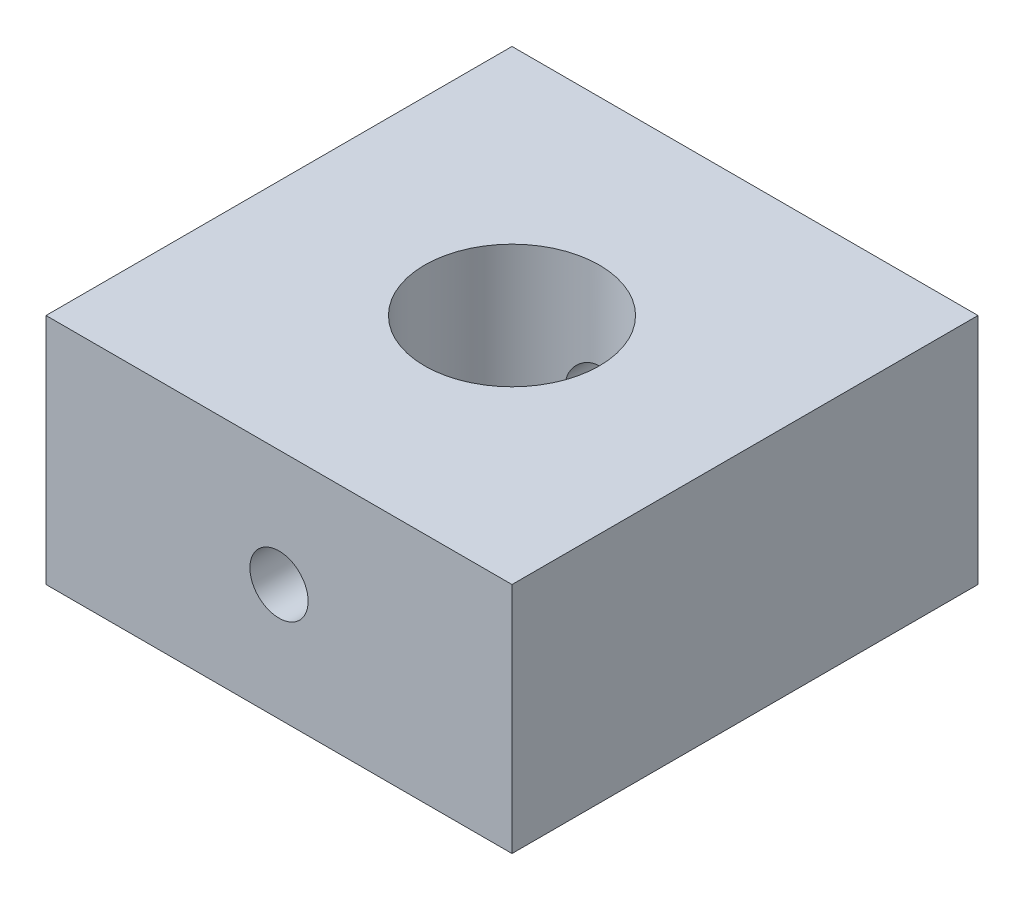
ISO-10303-21;
HEADER;
FILE_DESCRIPTION(('STEP AP214'),'2;1');
FILE_NAME('part.step','',(''),(''),'','','');
FILE_SCHEMA(('AUTOMOTIVE_DESIGN { 1 0 10303 214 1 1 1 1 }'));
ENDSEC;
DATA;
#1=APPLICATION_CONTEXT('core data for automotive mechanical design processes');
#2=APPLICATION_PROTOCOL_DEFINITION('international standard','automotive_design',2000,#1);
#3=PRODUCT_CONTEXT('',#1,'mechanical');
#4=PRODUCT('Part','Part','',(#3));
#5=PRODUCT_RELATED_PRODUCT_CATEGORY('part','',(#4));
#6=PRODUCT_DEFINITION_FORMATION('','',#4);
#7=PRODUCT_DEFINITION_CONTEXT('part definition',#1,'design');
#8=PRODUCT_DEFINITION('design','',#6,#7);
#9=PRODUCT_DEFINITION_SHAPE('','',#8);
#10=(LENGTH_UNIT() NAMED_UNIT(*) SI_UNIT(.MILLI.,.METRE.));
#11=(NAMED_UNIT(*) PLANE_ANGLE_UNIT() SI_UNIT($,.RADIAN.));
#12=(NAMED_UNIT(*) SI_UNIT($,.STERADIAN.) SOLID_ANGLE_UNIT());
#13=UNCERTAINTY_MEASURE_WITH_UNIT(LENGTH_MEASURE(1.E-05),#10,'distance_accuracy_value','');
#14=(GEOMETRIC_REPRESENTATION_CONTEXT(3) GLOBAL_UNCERTAINTY_ASSIGNED_CONTEXT((#13)) GLOBAL_UNIT_ASSIGNED_CONTEXT((#10,
#11,#12)) REPRESENTATION_CONTEXT('',''));
#15=CARTESIAN_POINT('',(0.,0.,0.));
#16=DIRECTION('',(0.,0.,1.));
#17=DIRECTION('',(1.,0.,0.));
#18=AXIS2_PLACEMENT_3D('',#15,#16,#17);
#19=CARTESIAN_POINT('',(0.,12.7,0.));
#20=DIRECTION('',(0.,-1.,0.));
#21=DIRECTION('',(0.,0.,-1.));
#22=AXIS2_PLACEMENT_3D('',#19,#20,#21);
#23=PLANE('',#22);
#24=DIRECTION('',(0.,0.,1.));
#25=VECTOR('',#24,1.);
#26=CARTESIAN_POINT('',(0.,12.7,0.));
#27=LINE('',#26,#25);
#28=CARTESIAN_POINT('',(0.,12.7,-25.4));
#29=VERTEX_POINT('',#28);
#30=CARTESIAN_POINT('',(0.,12.7,0.));
#31=VERTEX_POINT('',#30);
#32=EDGE_CURVE('E104',#29,#31,#27,.T.);
#33=ORIENTED_EDGE('',*,*,#32,.T.);
#34=DIRECTION('',(1.,0.,0.));
#35=VECTOR('',#34,1.);
#36=CARTESIAN_POINT('',(0.,12.7,0.));
#37=LINE('',#36,#35);
#38=CARTESIAN_POINT('',(25.4,12.7,0.));
#39=VERTEX_POINT('',#38);
#40=EDGE_CURVE('E99',#31,#39,#37,.T.);
#41=ORIENTED_EDGE('',*,*,#40,.T.);
#42=DIRECTION('',(0.,0.,-1.));
#43=VECTOR('',#42,1.);
#44=CARTESIAN_POINT('',(25.4,12.7,0.));
#45=LINE('',#44,#43);
#46=CARTESIAN_POINT('',(25.4,12.7,-25.4));
#47=VERTEX_POINT('',#46);
#48=EDGE_CURVE('E102',#39,#47,#45,.T.);
#49=ORIENTED_EDGE('',*,*,#48,.T.);
#50=DIRECTION('',(-1.,0.,0.));
#51=VECTOR('',#50,1.);
#52=CARTESIAN_POINT('',(0.,12.7,-25.4));
#53=LINE('',#52,#51);
#54=EDGE_CURVE('E69',#47,#29,#53,.T.);
#55=ORIENTED_EDGE('',*,*,#54,.T.);
#56=EDGE_LOOP('',(#33,#41,#49,#55));
#57=FACE_BOUND('',#56,.T.);
#58=CARTESIAN_POINT('',(12.7,12.7,-12.7));
#59=DIRECTION('',(0.,1.,0.));
#60=DIRECTION('',(0.,0.,1.));
#61=AXIS2_PLACEMENT_3D('',#58,#59,#60);
#62=CIRCLE('',#61,4.7625);
#63=CARTESIAN_POINT('',(12.7,12.7,-7.9375));
#64=VERTEX_POINT('',#63);
#65=EDGE_CURVE('E120',#64,#64,#62,.T.);
#66=ORIENTED_EDGE('',*,*,#65,.F.);
#67=EDGE_LOOP('',(#66));
#68=FACE_BOUND('',#67,.T.);
#69=ADVANCED_FACE('F46',(#57,#68),#23,.F.);
#70=CARTESIAN_POINT('',(0.,0.,0.));
#71=DIRECTION('',(0.,-1.,0.));
#72=DIRECTION('',(0.,0.,-1.));
#73=AXIS2_PLACEMENT_3D('',#70,#71,#72);
#74=PLANE('',#73);
#75=DIRECTION('',(0.,0.,1.));
#76=VECTOR('',#75,1.);
#77=CARTESIAN_POINT('',(0.,0.,0.));
#78=LINE('',#77,#76);
#79=CARTESIAN_POINT('',(0.,0.,-25.4));
#80=VERTEX_POINT('',#79);
#81=CARTESIAN_POINT('',(0.,0.,0.));
#82=VERTEX_POINT('',#81);
#83=EDGE_CURVE('E117',#80,#82,#78,.T.);
#84=ORIENTED_EDGE('',*,*,#83,.F.);
#85=DIRECTION('',(-1.,0.,0.));
#86=VECTOR('',#85,1.);
#87=CARTESIAN_POINT('',(0.,0.,-25.4));
#88=LINE('',#87,#86);
#89=CARTESIAN_POINT('',(25.4,0.,-25.4));
#90=VERTEX_POINT('',#89);
#91=EDGE_CURVE('E92',#90,#80,#88,.T.);
#92=ORIENTED_EDGE('',*,*,#91,.F.);
#93=DIRECTION('',(0.,0.,-1.));
#94=VECTOR('',#93,1.);
#95=CARTESIAN_POINT('',(25.4,0.,0.));
#96=LINE('',#95,#94);
#97=CARTESIAN_POINT('',(25.4,0.,0.));
#98=VERTEX_POINT('',#97);
#99=EDGE_CURVE('E86',#98,#90,#96,.T.);
#100=ORIENTED_EDGE('',*,*,#99,.F.);
#101=DIRECTION('',(1.,0.,0.));
#102=VECTOR('',#101,1.);
#103=CARTESIAN_POINT('',(0.,0.,0.));
#104=LINE('',#103,#102);
#105=EDGE_CURVE('E108',#82,#98,#104,.T.);
#106=ORIENTED_EDGE('',*,*,#105,.F.);
#107=EDGE_LOOP('',(#84,#92,#100,#106));
#108=FACE_BOUND('',#107,.T.);
#109=CARTESIAN_POINT('',(12.7,0.,-12.7));
#110=DIRECTION('',(0.,1.,0.));
#111=DIRECTION('',(0.,0.,1.));
#112=AXIS2_PLACEMENT_3D('',#109,#110,#111);
#113=CIRCLE('',#112,4.7625);
#114=CARTESIAN_POINT('',(12.7,0.,-7.9375));
#115=VERTEX_POINT('',#114);
#116=EDGE_CURVE('E174',#115,#115,#113,.T.);
#117=ORIENTED_EDGE('',*,*,#116,.T.);
#118=EDGE_LOOP('',(#117));
#119=FACE_BOUND('',#118,.T.);
#120=ADVANCED_FACE('F148',(#108,#119),#74,.T.);
#121=CARTESIAN_POINT('',(0.,12.7,0.));
#122=DIRECTION('',(1.,0.,0.));
#123=DIRECTION('',(0.,0.,-1.));
#124=AXIS2_PLACEMENT_3D('',#121,#122,#123);
#125=PLANE('',#124);
#126=ORIENTED_EDGE('',*,*,#83,.T.);
#127=DIRECTION('',(0.,-1.,0.));
#128=VECTOR('',#127,1.);
#129=CARTESIAN_POINT('',(0.,12.7,0.));
#130=LINE('',#129,#128);
#131=EDGE_CURVE('E13',#31,#82,#130,.T.);
#132=ORIENTED_EDGE('',*,*,#131,.F.);
#133=ORIENTED_EDGE('',*,*,#32,.F.);
#134=DIRECTION('',(0.,-1.,0.));
#135=VECTOR('',#134,1.);
#136=CARTESIAN_POINT('',(0.,12.7,-25.4));
#137=LINE('',#136,#135);
#138=EDGE_CURVE('E113',#29,#80,#137,.T.);
#139=ORIENTED_EDGE('',*,*,#138,.T.);
#140=EDGE_LOOP('',(#126,#132,#133,#139));
#141=FACE_BOUND('',#140,.T.);
#142=ADVANCED_FACE('F48',(#141),#125,.F.);
#143=CARTESIAN_POINT('',(0.,12.7,0.));
#144=DIRECTION('',(0.,0.,-1.));
#145=DIRECTION('',(-1.,0.,0.));
#146=AXIS2_PLACEMENT_3D('',#143,#144,#145);
#147=PLANE('',#146);
#148=CARTESIAN_POINT('',(12.7,6.35,0.));
#149=DIRECTION('',(0.,0.,1.));
#150=DIRECTION('',(1.,0.,0.));
#151=AXIS2_PLACEMENT_3D('',#148,#149,#150);
#152=CIRCLE('',#151,1.5875);
#153=CARTESIAN_POINT('',(14.2875,6.35,0.));
#154=VERTEX_POINT('',#153);
#155=EDGE_CURVE('E167',#154,#154,#152,.T.);
#156=ORIENTED_EDGE('',*,*,#155,.F.);
#157=EDGE_LOOP('',(#156));
#158=FACE_BOUND('',#157,.T.);
#159=ORIENTED_EDGE('',*,*,#105,.T.);
#160=DIRECTION('',(0.,-1.,0.));
#161=VECTOR('',#160,1.);
#162=CARTESIAN_POINT('',(25.4,12.7,0.));
#163=LINE('',#162,#161);
#164=EDGE_CURVE('E60',#39,#98,#163,.T.);
#165=ORIENTED_EDGE('',*,*,#164,.F.);
#166=ORIENTED_EDGE('',*,*,#40,.F.);
#167=ORIENTED_EDGE('',*,*,#131,.T.);
#168=EDGE_LOOP('',(#159,#165,#166,#167));
#169=FACE_BOUND('',#168,.T.);
#170=ADVANCED_FACE('F107',(#158,#169),#147,.F.);
#171=CARTESIAN_POINT('',(25.4,12.7,0.));
#172=DIRECTION('',(-1.,0.,0.));
#173=DIRECTION('',(0.,0.,1.));
#174=AXIS2_PLACEMENT_3D('',#171,#172,#173);
#175=PLANE('',#174);
#176=ORIENTED_EDGE('',*,*,#99,.T.);
#177=DIRECTION('',(0.,-1.,0.));
#178=VECTOR('',#177,1.);
#179=CARTESIAN_POINT('',(25.4,12.7,-25.4));
#180=LINE('',#179,#178);
#181=EDGE_CURVE('E109',#47,#90,#180,.T.);
#182=ORIENTED_EDGE('',*,*,#181,.F.);
#183=ORIENTED_EDGE('',*,*,#48,.F.);
#184=ORIENTED_EDGE('',*,*,#164,.T.);
#185=EDGE_LOOP('',(#176,#182,#183,#184));
#186=FACE_BOUND('',#185,.T.);
#187=ADVANCED_FACE('F111',(#186),#175,.F.);
#188=CARTESIAN_POINT('',(0.,12.7,-25.4));
#189=DIRECTION('',(0.,0.,1.));
#190=DIRECTION('',(1.,0.,0.));
#191=AXIS2_PLACEMENT_3D('',#188,#189,#190);
#192=PLANE('',#191);
#193=CARTESIAN_POINT('',(12.7,6.35,-25.4));
#194=DIRECTION('',(0.,0.,1.));
#195=DIRECTION('',(1.,0.,0.));
#196=AXIS2_PLACEMENT_3D('',#193,#194,#195);
#197=CIRCLE('',#196,1.5875);
#198=CARTESIAN_POINT('',(14.2875,6.35,-25.4));
#199=VERTEX_POINT('',#198);
#200=EDGE_CURVE('E129',#199,#199,#197,.T.);
#201=ORIENTED_EDGE('',*,*,#200,.T.);
#202=EDGE_LOOP('',(#201));
#203=FACE_BOUND('',#202,.T.);
#204=ORIENTED_EDGE('',*,*,#91,.T.);
#205=ORIENTED_EDGE('',*,*,#138,.F.);
#206=ORIENTED_EDGE('',*,*,#54,.F.);
#207=ORIENTED_EDGE('',*,*,#181,.T.);
#208=EDGE_LOOP('',(#204,#205,#206,#207));
#209=FACE_BOUND('',#208,.T.);
#210=ADVANCED_FACE('F144',(#203,#209),#192,.F.);
#211=CARTESIAN_POINT('',(12.7,12.7,-12.7));
#212=DIRECTION('',(0.,-1.,0.));
#213=DIRECTION('',(0.,0.,-1.));
#214=AXIS2_PLACEMENT_3D('',#211,#212,#213);
#215=CYLINDRICAL_SURFACE('',#214,4.7625);
#216=CARTESIAN_POINT('',(12.7,7.9375,-17.4625));
#217=CARTESIAN_POINT('',(12.6133806614173,7.93750040279898,-17.4625002429025));
#218=CARTESIAN_POINT('',(12.5267637536701,7.93038757752304,-17.4601150909323));
#219=CARTESIAN_POINT('',(12.3560812046142,7.90221128975267,-17.4508352119771));
#220=CARTESIAN_POINT('',(12.2720158291114,7.88114637898109,-17.4439400168342));
#221=CARTESIAN_POINT('',(12.1089216966659,7.82586820112782,-17.4263892630148));
#222=CARTESIAN_POINT('',(12.0298847764059,7.79167691334591,-17.4157399927273));
#223=CARTESIAN_POINT('',(11.8786672878215,7.71121588811913,-17.3917680757628));
#224=CARTESIAN_POINT('',(11.8064880758281,7.66494376805837,-17.378444901851));
#225=CARTESIAN_POINT('',(11.6685350909022,7.55995153478673,-17.3500112492827));
#226=CARTESIAN_POINT('',(11.6030316257764,7.50088791561147,-17.3348579588626));
#227=CARTESIAN_POINT('',(11.4826531003354,7.37271964190333,-17.3047074971821));
#228=CARTESIAN_POINT('',(11.4277803805355,7.30361278205099,-17.2897103609875));
#229=CARTESIAN_POINT('',(11.3286779042133,7.15488612962562,-17.2610991530767));
#230=CARTESIAN_POINT('',(11.2847995375741,7.07502118817526,-17.2475372485016));
#231=CARTESIAN_POINT('',(11.2112125377191,6.90852045004706,-17.2239829735203));
#232=CARTESIAN_POINT('',(11.1814995803985,6.82188672900415,-17.2139895140518));
#233=CARTESIAN_POINT('',(11.1381008798542,6.64738126087398,-17.1991544394014));
#234=CARTESIAN_POINT('',(11.1239086508686,6.55964968152361,-17.1941505203426));
#235=CARTESIAN_POINT('',(11.1103709667065,6.38291879027754,-17.1893810489934));
#236=CARTESIAN_POINT('',(11.1110209237025,6.29391987862416,-17.1896138779858));
#237=CARTESIAN_POINT('',(11.1267559028708,6.12150059917012,-17.1951493632549));
#238=CARTESIAN_POINT('',(11.1411799128474,6.03801116036606,-17.2002198518971));
#239=CARTESIAN_POINT('',(11.1829752164765,5.87471294637415,-17.2144794413772));
#240=CARTESIAN_POINT('',(11.2103480602854,5.79490461312183,-17.2236690353227));
#241=CARTESIAN_POINT('',(11.2776967453294,5.63973226002353,-17.2452968392086));
#242=CARTESIAN_POINT('',(11.3178684476772,5.56446050956713,-17.2577849819657));
#243=CARTESIAN_POINT('',(11.4095385437438,5.42151743310594,-17.2845818673897));
#244=CARTESIAN_POINT('',(11.4610402091221,5.35384831099326,-17.2988911354236));
#245=CARTESIAN_POINT('',(11.5770829343669,5.22431708791978,-17.3286313505379));
#246=CARTESIAN_POINT('',(11.6421643742539,5.16294259746685,-17.3440818560081));
#247=CARTESIAN_POINT('',(11.7818859326725,5.05185161417186,-17.3737101468942));
#248=CARTESIAN_POINT('',(11.8565269668885,5.00213623941386,-17.3878878101668));
#249=CARTESIAN_POINT('',(12.014283164289,4.91538212337683,-17.4135590885125));
#250=CARTESIAN_POINT('',(12.0974750486891,4.87847403249659,-17.4250246813776));
#251=CARTESIAN_POINT('',(12.2693603301588,4.81932746134531,-17.4437765034179));
#252=CARTESIAN_POINT('',(12.358051804429,4.79708388526529,-17.4510641842712));
#253=CARTESIAN_POINT('',(12.5342906706222,4.76876163018951,-17.4603985797591));
#254=CARTESIAN_POINT('',(12.6217210102146,4.76202405293826,-17.4626587791104));
#255=CARTESIAN_POINT('',(12.7964804235619,4.76302811933757,-17.4623238302804));
#256=CARTESIAN_POINT('',(12.8838095119199,4.77076731896805,-17.4597295016574));
#257=CARTESIAN_POINT('',(13.053250287758,4.79998390353083,-17.450117892384));
#258=CARTESIAN_POINT('',(13.1354398308503,4.82105685210357,-17.4432309045402));
#259=CARTESIAN_POINT('',(13.2950838342451,4.87583709309093,-17.4258580684274));
#260=CARTESIAN_POINT('',(13.3725376892574,4.90954599665511,-17.415371761241));
#261=CARTESIAN_POINT('',(13.5227826705243,4.98962431054725,-17.3915217841857));
#262=CARTESIAN_POINT('',(13.5953975602572,5.03630341683703,-17.3780896842481));
#263=CARTESIAN_POINT('',(13.7319779178402,5.1406332131464,-17.3498709059207));
#264=CARTESIAN_POINT('',(13.7959407338755,5.19828725395042,-17.335083814552));
#265=CARTESIAN_POINT('',(13.9164258561425,5.32602876722296,-17.3049699616896));
#266=CARTESIAN_POINT('',(13.9724780386777,5.39656214774639,-17.2896492072629));
#267=CARTESIAN_POINT('',(14.0720088166887,5.54636236389978,-17.2608870760535));
#268=CARTESIAN_POINT('',(14.1154873073405,5.62562927233159,-17.2474457149393));
#269=CARTESIAN_POINT('',(14.188435127036,5.79068091177271,-17.2240954696882));
#270=CARTESIAN_POINT('',(14.217932784812,5.87645205068041,-17.2141794525885));
#271=CARTESIAN_POINT('',(14.2619327834805,6.05215110694505,-17.1991469628649));
#272=CARTESIAN_POINT('',(14.2764418797394,6.1420771325794,-17.1940283281503));
#273=CARTESIAN_POINT('',(14.2895260984328,6.31856288996495,-17.1894160096276));
#274=CARTESIAN_POINT('',(14.2888815334771,6.40505821520533,-17.1896468540865));
#275=CARTESIAN_POINT('',(14.2735971408498,6.57663955643877,-17.1950264084539));
#276=CARTESIAN_POINT('',(14.2589581461405,6.6617256560037,-17.2001748256636));
#277=CARTESIAN_POINT('',(14.2166527533428,6.82646536501642,-17.2146043233402));
#278=CARTESIAN_POINT('',(14.1892390617996,6.90619145969463,-17.2238050561068));
#279=CARTESIAN_POINT('',(14.1223672431436,7.0599735085145,-17.2452728312432));
#280=CARTESIAN_POINT('',(14.0829064425792,7.13402819951096,-17.2575405541189));
#281=CARTESIAN_POINT('',(13.9910513494762,7.27786782600262,-17.2844274139635));
#282=CARTESIAN_POINT('',(13.9381678353888,7.34732544676368,-17.2991257973189));
#283=CARTESIAN_POINT('',(13.8217955769778,7.47663257874741,-17.3288857809966));
#284=CARTESIAN_POINT('',(13.7583038340667,7.53647936390482,-17.3439474829839));
#285=CARTESIAN_POINT('',(13.6195459716116,7.64721675450907,-17.373441734593));
#286=CARTESIAN_POINT('',(13.5439174026808,7.69766740205471,-17.3878268860949));
#287=CARTESIAN_POINT('',(13.384779804883,7.7850848058004,-17.4137001098652));
#288=CARTESIAN_POINT('',(13.3012727975351,7.82205500915124,-17.4251889225384));
#289=CARTESIAN_POINT('',(13.1325836649316,7.87990809157577,-17.4435375517131));
#290=CARTESIAN_POINT('',(13.0476430653113,7.90143591519311,-17.4505812472075));
#291=CARTESIAN_POINT('',(12.8751336604163,7.93022969557494,-17.4600617121445));
#292=CARTESIAN_POINT('',(12.7875655880904,7.93749959280075,-17.462499754444));
#293=CARTESIAN_POINT('',(12.7,7.9375,-17.4625));
#294=B_SPLINE_CURVE_WITH_KNOTS('',3,(#216,#217,#218,#219,#220,#221,#222,#223,#224,#225,#226,
#227,#228,#229,#230,#231,#232,#233,#234,#235,#236,#237,#238,#239,#240,#241,#242,#243,#244,#245,
#246,#247,#248,#249,#250,#251,#252,#253,#254,#255,#256,#257,#258,#259,#260,#261,#262,#263,#264,
#265,#266,#267,#268,#269,#270,#271,#272,#273,#274,#275,#276,#277,#278,#279,#280,#281,#282,#283,
#284,#285,#286,#287,#288,#289,#290,#291,#292,#293),.UNSPECIFIED.,.T.,.F.,(4,2,2,2,2,2,2,2,2,2,2,
2,2,2,2,2,2,2,2,2,2,2,2,2,2,2,2,2,2,2,2,2,2,2,2,2,2,2,4),(0.,0.259535780816293,
0.519098506612189,0.778228493181559,1.03740962475607,1.30468186298875,1.57201287843954,
1.84703060907259,2.12196433449873,2.38763057115171,2.65321468955133,2.90666212150157,
3.16013990233078,3.4176997170877,3.67533400311154,3.94641872975545,4.21752944222006,
4.49132968969942,4.76503474342568,5.02687563290582,5.2886723214813,5.54288575790414,
5.79713161888515,6.05806509751932,6.31907837054752,6.59195123823194,6.86482638073057,
7.13714621949998,7.40934326970522,7.6675561987701,7.92575375970309,8.17904744490163,
8.43239738104365,8.6968023087324,8.96128210158999,9.23606961575722,9.51078681329525,
9.77323036418429,10.0356013733555),.UNSPECIFIED.);
#295=CARTESIAN_POINT('',(12.7,7.9375,-17.4625));
#296=VERTEX_POINT('',#295);
#297=EDGE_CURVE('E50',#296,#296,#294,.T.);
#298=ORIENTED_EDGE('',*,*,#297,.F.);
#299=EDGE_LOOP('',(#298));
#300=FACE_BOUND('',#299,.T.);
#301=CARTESIAN_POINT('',(14.2875,6.35,-8.20987193946543));
#302=CARTESIAN_POINT('',(14.287500409492,6.26353177244774,-8.20987222432936));
#303=CARTESIAN_POINT('',(14.2804114691008,6.17706600528005,-8.20734691250764));
#304=CARTESIAN_POINT('',(14.252338671556,6.00669610667163,-8.19757101146008));
#305=CARTESIAN_POINT('',(14.2313525255673,5.92279239957745,-8.19031964386776));
#306=CARTESIAN_POINT('',(14.1763043335248,5.7600423073668,-8.17200226644044));
#307=CARTESIAN_POINT('',(14.1422679139777,5.68118636200969,-8.16094373695527));
#308=CARTESIAN_POINT('',(14.0621728351507,5.53027842293011,-8.1362689380861));
#309=CARTESIAN_POINT('',(14.0161115233155,5.45822793519611,-8.12265210455516));
#310=CARTESIAN_POINT('',(13.9113436949781,5.32015705978793,-8.09379748065637));
#311=CARTESIAN_POINT('',(13.8522461419374,5.25444175698363,-8.07851929434128));
#312=CARTESIAN_POINT('',(13.7239179217029,5.13364670305588,-8.04840489628408));
#313=CARTESIAN_POINT('',(13.6546856303956,5.07856865986299,-8.03356875584024));
#314=CARTESIAN_POINT('',(13.5058221563945,4.97922725048927,-8.00554236261645));
#315=CARTESIAN_POINT('',(13.4259667840689,4.93528354664399,-7.99240515273701));
#316=CARTESIAN_POINT('',(13.2594845664926,4.86157335861008,-7.96973281001065));
#317=CARTESIAN_POINT('',(13.1728595535284,4.83180305358166,-7.96019670652735));
#318=CARTESIAN_POINT('',(12.9984957476757,4.78831933077108,-7.94608717751848));
#319=CARTESIAN_POINT('',(12.9109005733291,4.774083279067,-7.94135262790623));
#320=CARTESIAN_POINT('',(12.7344453762832,4.76041038428995,-7.93680771953534));
#321=CARTESIAN_POINT('',(12.6455856854991,4.76096972675179,-7.93699609157662));
#322=CARTESIAN_POINT('',(12.4728231696298,4.77654025412358,-7.94216662105257));
#323=CARTESIAN_POINT('',(12.3888626228607,4.79098376395328,-7.94696047201223));
#324=CARTESIAN_POINT('',(12.2246335408698,4.83297385730647,-7.96056689348205));
#325=CARTESIAN_POINT('',(12.1443652562756,4.86052132888036,-7.96937973635605));
#326=CARTESIAN_POINT('',(11.9885579461883,4.92826884122348,-7.99027373409399));
#327=CARTESIAN_POINT('',(11.9130949492117,4.96863042744301,-8.00239632492723));
#328=CARTESIAN_POINT('',(11.7698451332256,5.06072728239932,-8.0286480105112));
#329=CARTESIAN_POINT('',(11.7020604566642,5.11246571378104,-8.04277766281678));
#330=CARTESIAN_POINT('',(11.5727148743488,5.22870809961892,-8.07233920436712));
#331=CARTESIAN_POINT('',(11.5115972506553,5.29369838807964,-8.08780108413392));
#332=CARTESIAN_POINT('',(11.4009848503915,5.43313735208472,-8.11772355298387));
#333=CARTESIAN_POINT('',(11.3514918650541,5.50758748256977,-8.13218398751324));
#334=CARTESIAN_POINT('',(11.2649199151197,5.66523763066447,-8.15863041347345));
#335=CARTESIAN_POINT('',(11.228027988954,5.7485472585464,-8.17057818924622));
#336=CARTESIAN_POINT('',(11.168946430637,5.92069458839769,-8.19020379230701));
#337=CARTESIAN_POINT('',(11.1467506367381,6.00952995643965,-8.19788340891809));
#338=CARTESIAN_POINT('',(11.1185939646814,6.18591338919848,-8.20769827370464));
#339=CARTESIAN_POINT('',(11.1119458108846,6.27333871178384,-8.21006802999717));
#340=CARTESIAN_POINT('',(11.1131263657278,6.4480696367233,-8.20965033100305));
#341=CARTESIAN_POINT('',(11.1209524449517,6.53537525793931,-8.20686381241482));
#342=CARTESIAN_POINT('',(11.1502417781615,6.70426168306647,-8.19668131283111));
#343=CARTESIAN_POINT('',(11.1712273495559,6.78593612036414,-8.18944695863059));
#344=CARTESIAN_POINT('',(11.2256667431851,6.94458797490502,-8.1713617104686));
#345=CARTESIAN_POINT('',(11.259122775773,7.02156455665045,-8.16051017540836));
#346=CARTESIAN_POINT('',(11.338759484077,7.17134141809452,-8.13598706816799));
#347=CARTESIAN_POINT('',(11.3853100996059,7.24393179519384,-8.12223696755845));
#348=CARTESIAN_POINT('',(11.4893953114899,7.38051935815918,-8.09361842139564));
#349=CARTESIAN_POINT('',(11.5469331457707,7.44451400137469,-8.07874964695469));
#350=CARTESIAN_POINT('',(11.6746469168832,7.56527567474388,-8.04870376162424));
#351=CARTESIAN_POINT('',(11.7452977080072,7.62154684415492,-8.03354623320092));
#352=CARTESIAN_POINT('',(11.8954116749021,7.72146687597752,-8.00533623064188));
#353=CARTESIAN_POINT('',(11.9748745375275,7.76511618672035,-7.99228368174409));
#354=CARTESIAN_POINT('',(12.1399619683887,7.83815441646797,-7.96981505775669));
#355=CARTESIAN_POINT('',(12.2255420917276,7.86763615247255,-7.96037539867807));
#356=CARTESIAN_POINT('',(12.4008221854694,7.91166779052042,-7.94609455295033));
#357=CARTESIAN_POINT('',(12.4905206565232,7.9262230824353,-7.94125170645995));
#358=CARTESIAN_POINT('',(12.6669556543222,7.93950354819896,-7.93683542112443));
#359=CARTESIAN_POINT('',(12.753633249223,7.93894058311765,-7.93702501858016));
#360=CARTESIAN_POINT('',(12.9256014426878,7.92375652331758,-7.94206888025456));
#361=CARTESIAN_POINT('',(13.0108921532003,7.90913656905748,-7.94692276605449));
#362=CARTESIAN_POINT('',(13.1763168645984,7.86672570261066,-7.96066297509871));
#363=CARTESIAN_POINT('',(13.2565112550741,7.83914768312722,-7.96948402351677));
#364=CARTESIAN_POINT('',(13.4111656321169,7.77180066938327,-7.99025007381614));
#365=CARTESIAN_POINT('',(13.4856245783261,7.73202946987474,-8.00219564073774));
#366=CARTESIAN_POINT('',(13.6296940008902,7.63973339953806,-8.02852933235739));
#367=CARTESIAN_POINT('',(13.6990236743477,7.58679158695665,-8.04299139919067));
#368=CARTESIAN_POINT('',(13.8280473792075,7.47036639153954,-8.07254880292892));
#369=CARTESIAN_POINT('',(13.887738324329,7.40687964540792,-8.08764434072708));
#370=CARTESIAN_POINT('',(13.9981651215226,7.26819514800572,-8.11747043276863));
#371=CARTESIAN_POINT('',(14.0484589585217,7.19263625132458,-8.13216356818049));
#372=CARTESIAN_POINT('',(14.1355990199905,7.03368159729184,-8.15879443099713));
#373=CARTESIAN_POINT('',(14.1724487582009,6.95028789481541,-8.17073287806517));
#374=CARTESIAN_POINT('',(14.2301020772741,6.78186060437519,-8.18989131947158));
#375=CARTESIAN_POINT('',(14.2515556807749,6.69707153165348,-8.19730020339223));
#376=CARTESIAN_POINT('',(14.280251983237,6.52485351988411,-8.20728953631015));
#377=CARTESIAN_POINT('',(14.2874995859746,6.4374255023605,-8.20987165144781));
#378=CARTESIAN_POINT('',(14.2875,6.35,-8.20987193946543));
#379=B_SPLINE_CURVE_WITH_KNOTS('',3,(#301,#302,#303,#304,#305,#306,#307,#308,#309,#310,#311,
#312,#313,#314,#315,#316,#317,#318,#319,#320,#321,#322,#323,#324,#325,#326,#327,#328,#329,#330,
#331,#332,#333,#334,#335,#336,#337,#338,#339,#340,#341,#342,#343,#344,#345,#346,#347,#348,#349,
#350,#351,#352,#353,#354,#355,#356,#357,#358,#359,#360,#361,#362,#363,#364,#365,#366,#367,#368,
#369,#370,#371,#372,#373,#374,#375,#376,#377,#378),.UNSPECIFIED.,.T.,.F.,(4,2,2,2,2,2,2,2,2,2,2,
2,2,2,2,2,2,2,2,2,2,2,2,2,2,2,2,2,2,2,2,2,2,2,2,2,2,2,4),(0.,0.259080928368978,
0.518204537336573,0.776821896157564,1.03549635131939,1.30335873166265,1.57126408460531,
1.84615941003056,2.12098058764028,2.38623981039333,2.65143064617445,2.90622045160591,
3.16102752650413,3.41918377090782,3.6774118710001,3.94779776802719,4.21822530134218,
4.49250815749182,4.76667594024978,5.02847437537399,5.29022525637959,5.54298478279283,
5.79578913142127,6.05661186651798,6.31751158484978,6.5909635796796,6.86440586023933,
7.13603143511828,7.40755889265449,7.66632459422097,7.92506930361878,8.17970417710533,
8.43438513082998,8.69847637235357,8.96265200783153,9.2371688308998,9.51161385495001,
9.77365349304622,10.0356026616121),.UNSPECIFIED.);
#380=CARTESIAN_POINT('',(14.2875,6.35,-8.20987193946543));
#381=VERTEX_POINT('',#380);
#382=EDGE_CURVE('E125',#381,#381,#379,.T.);
#383=ORIENTED_EDGE('',*,*,#382,.F.);
#384=EDGE_LOOP('',(#383));
#385=FACE_BOUND('',#384,.T.);
#386=ORIENTED_EDGE('',*,*,#65,.T.);
#387=EDGE_LOOP('',(#386));
#388=FACE_BOUND('',#387,.T.);
#389=ORIENTED_EDGE('',*,*,#116,.F.);
#390=EDGE_LOOP('',(#389));
#391=FACE_BOUND('',#390,.T.);
#392=ADVANCED_FACE('F130',(#300,#385,#388,#391),#215,.F.);
#393=CARTESIAN_POINT('',(12.7,6.35,-25.4));
#394=DIRECTION('',(0.,0.,1.));
#395=DIRECTION('',(1.,0.,0.));
#396=AXIS2_PLACEMENT_3D('',#393,#394,#395);
#397=CYLINDRICAL_SURFACE('',#396,1.5875);
#398=ORIENTED_EDGE('',*,*,#382,.T.);
#399=EDGE_LOOP('',(#398));
#400=FACE_BOUND('',#399,.T.);
#401=ORIENTED_EDGE('',*,*,#155,.T.);
#402=EDGE_LOOP('',(#401));
#403=FACE_BOUND('',#402,.T.);
#404=ADVANCED_FACE('F133',(#400,#403),#397,.F.);
#405=ORIENTED_EDGE('',*,*,#297,.T.);
#406=EDGE_LOOP('',(#405));
#407=FACE_BOUND('',#406,.T.);
#408=ORIENTED_EDGE('',*,*,#200,.F.);
#409=EDGE_LOOP('',(#408));
#410=FACE_BOUND('',#409,.T.);
#411=ADVANCED_FACE('F136',(#407,#410),#397,.F.);
#412=CLOSED_SHELL('',(#69,#120,#142,#170,#187,#210,#392,#404,#411));
#413=MANIFOLD_SOLID_BREP('B2',#412);
#414=ADVANCED_BREP_SHAPE_REPRESENTATION('',(#18,#413),#14);
#415=SHAPE_DEFINITION_REPRESENTATION(#9,#414);
ENDSEC;
END-ISO-10303-21;
